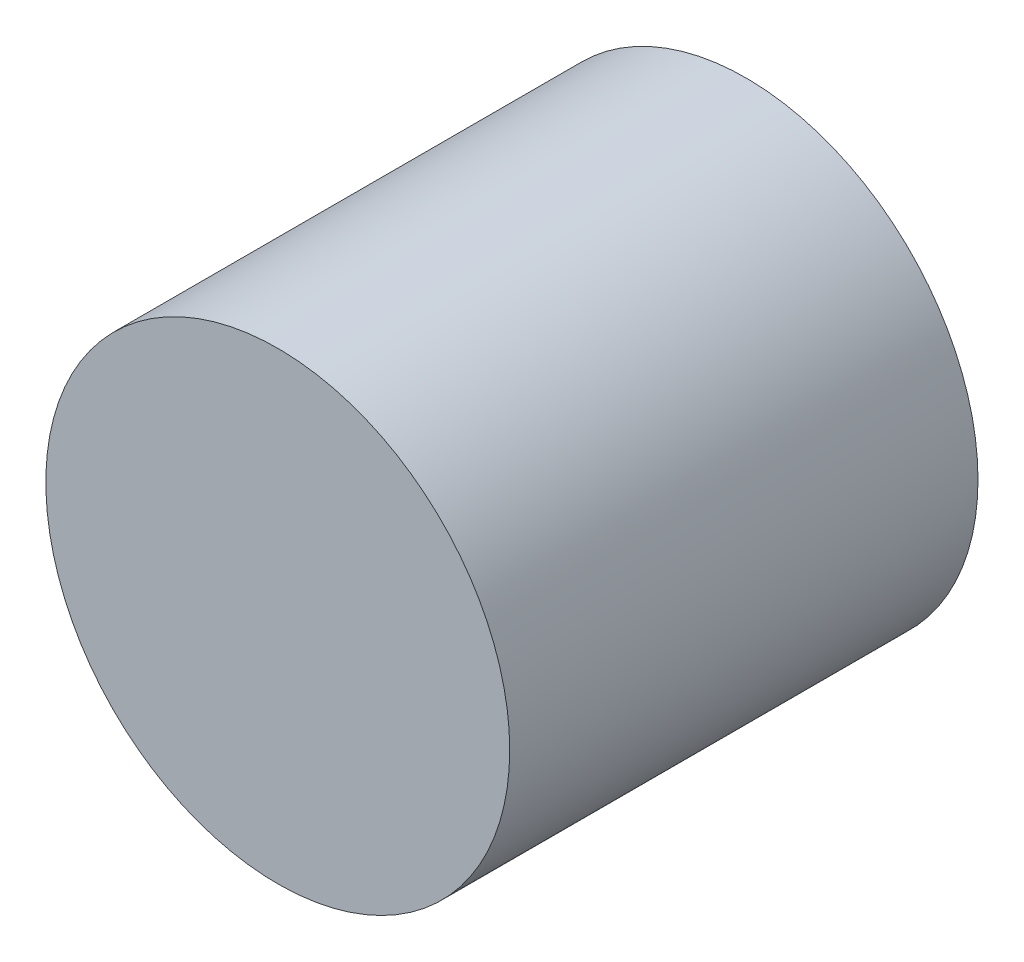
ISO-10303-21;
HEADER;
FILE_DESCRIPTION(('STEP AP214'),'2;1');
FILE_NAME('part.step','',(''),(''),'','','');
FILE_SCHEMA(('AUTOMOTIVE_DESIGN { 1 0 10303 214 1 1 1 1 }'));
ENDSEC;
DATA;
#1=APPLICATION_CONTEXT('core data for automotive mechanical design processes');
#2=APPLICATION_PROTOCOL_DEFINITION('international standard','automotive_design',2000,#1);
#3=PRODUCT_CONTEXT('',#1,'mechanical');
#4=PRODUCT('Part','Part','',(#3));
#5=PRODUCT_RELATED_PRODUCT_CATEGORY('part','',(#4));
#6=PRODUCT_DEFINITION_FORMATION('','',#4);
#7=PRODUCT_DEFINITION_CONTEXT('part definition',#1,'design');
#8=PRODUCT_DEFINITION('design','',#6,#7);
#9=PRODUCT_DEFINITION_SHAPE('','',#8);
#10=(LENGTH_UNIT() NAMED_UNIT(*) SI_UNIT(.MILLI.,.METRE.));
#11=(NAMED_UNIT(*) PLANE_ANGLE_UNIT() SI_UNIT($,.RADIAN.));
#12=(NAMED_UNIT(*) SI_UNIT($,.STERADIAN.) SOLID_ANGLE_UNIT());
#13=UNCERTAINTY_MEASURE_WITH_UNIT(LENGTH_MEASURE(1.E-05),#10,'distance_accuracy_value','');
#14=(GEOMETRIC_REPRESENTATION_CONTEXT(3) GLOBAL_UNCERTAINTY_ASSIGNED_CONTEXT((#13)) GLOBAL_UNIT_ASSIGNED_CONTEXT((#10,
#11,#12)) REPRESENTATION_CONTEXT('',''));
#15=CARTESIAN_POINT('',(0.,0.,0.));
#16=DIRECTION('',(0.,0.,1.));
#17=DIRECTION('',(1.,0.,0.));
#18=AXIS2_PLACEMENT_3D('',#15,#16,#17);
#19=CARTESIAN_POINT('',(0.,0.,16.));
#20=DIRECTION('',(0.,0.,-1.));
#21=DIRECTION('',(-1.,0.,0.));
#22=AXIS2_PLACEMENT_3D('',#19,#20,#21);
#23=CYLINDRICAL_SURFACE('',#22,7.925);
#24=CARTESIAN_POINT('',(0.,0.,16.));
#25=DIRECTION('',(0.,0.,1.));
#26=DIRECTION('',(1.,0.,0.));
#27=AXIS2_PLACEMENT_3D('',#24,#25,#26);
#28=CIRCLE('',#27,7.925);
#29=CARTESIAN_POINT('',(7.925,0.,16.));
#30=VERTEX_POINT('',#29);
#31=EDGE_CURVE('E10',#30,#30,#28,.T.);
#32=ORIENTED_EDGE('',*,*,#31,.F.);
#33=EDGE_LOOP('',(#32));
#34=FACE_BOUND('',#33,.T.);
#35=CARTESIAN_POINT('',(0.,0.,0.));
#36=DIRECTION('',(0.,0.,1.));
#37=DIRECTION('',(1.,0.,0.));
#38=AXIS2_PLACEMENT_3D('',#35,#36,#37);
#39=CIRCLE('',#38,7.925);
#40=CARTESIAN_POINT('',(7.925,0.,0.));
#41=VERTEX_POINT('',#40);
#42=EDGE_CURVE('E40',#41,#41,#39,.T.);
#43=ORIENTED_EDGE('',*,*,#42,.T.);
#44=EDGE_LOOP('',(#43));
#45=FACE_BOUND('',#44,.T.);
#46=ADVANCED_FACE('F37',(#34,#45),#23,.T.);
#47=CARTESIAN_POINT('',(0.,0.,16.));
#48=DIRECTION('',(0.,0.,1.));
#49=DIRECTION('',(1.,0.,0.));
#50=AXIS2_PLACEMENT_3D('',#47,#48,#49);
#51=PLANE('',#50);
#52=ORIENTED_EDGE('',*,*,#31,.T.);
#53=EDGE_LOOP('',(#52));
#54=FACE_BOUND('',#53,.T.);
#55=ADVANCED_FACE('F54',(#54),#51,.T.);
#56=CARTESIAN_POINT('',(0.,0.,0.));
#57=DIRECTION('',(0.,0.,1.));
#58=DIRECTION('',(1.,0.,0.));
#59=AXIS2_PLACEMENT_3D('',#56,#57,#58);
#60=PLANE('',#59);
#61=ORIENTED_EDGE('',*,*,#42,.F.);
#62=EDGE_LOOP('',(#61));
#63=FACE_BOUND('',#62,.T.);
#64=ADVANCED_FACE('F52',(#63),#60,.F.);
#65=CLOSED_SHELL('',(#46,#55,#64));
#66=MANIFOLD_SOLID_BREP('B2',#65);
#67=ADVANCED_BREP_SHAPE_REPRESENTATION('',(#18,#66),#14);
#68=SHAPE_DEFINITION_REPRESENTATION(#9,#67);
ENDSEC;
END-ISO-10303-21;
